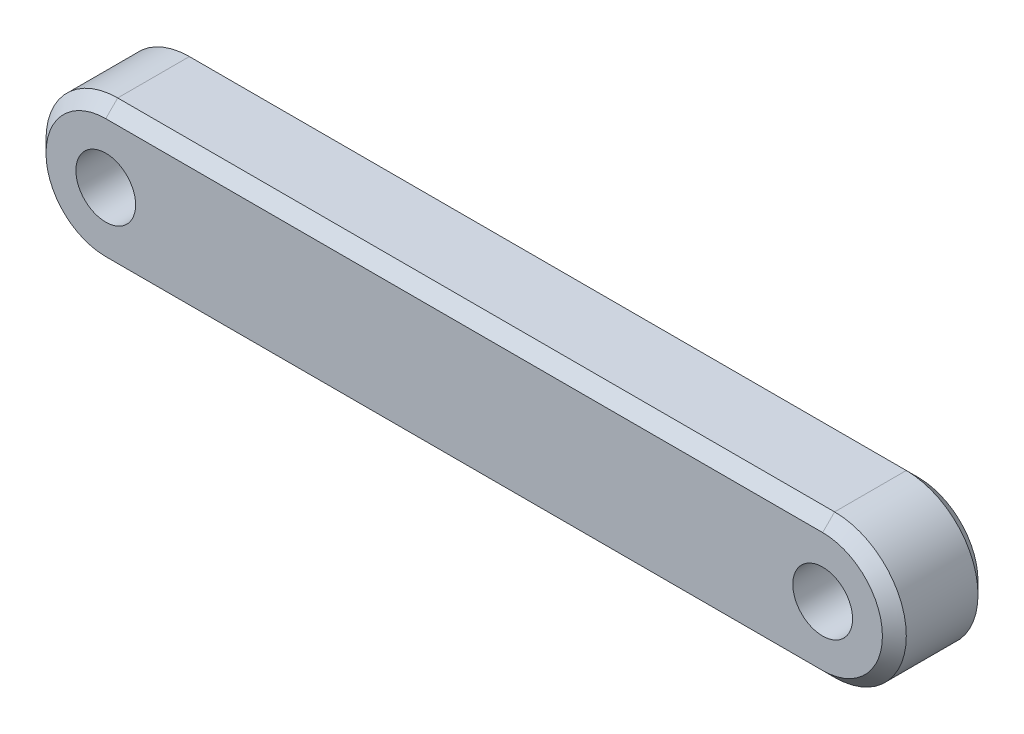
ISO-10303-21;
HEADER;
FILE_DESCRIPTION(('STEP AP214'),'2;1');
FILE_NAME('part.step','',(''),(''),'','','');
FILE_SCHEMA(('AUTOMOTIVE_DESIGN { 1 0 10303 214 1 1 1 1 }'));
ENDSEC;
DATA;
#1=APPLICATION_CONTEXT('core data for automotive mechanical design processes');
#2=APPLICATION_PROTOCOL_DEFINITION('international standard','automotive_design',2000,#1);
#3=PRODUCT_CONTEXT('',#1,'mechanical');
#4=PRODUCT('Part','Part','',(#3));
#5=PRODUCT_RELATED_PRODUCT_CATEGORY('part','',(#4));
#6=PRODUCT_DEFINITION_FORMATION('','',#4);
#7=PRODUCT_DEFINITION_CONTEXT('part definition',#1,'design');
#8=PRODUCT_DEFINITION('design','',#6,#7);
#9=PRODUCT_DEFINITION_SHAPE('','',#8);
#10=(LENGTH_UNIT() NAMED_UNIT(*) SI_UNIT(.MILLI.,.METRE.));
#11=(NAMED_UNIT(*) PLANE_ANGLE_UNIT() SI_UNIT($,.RADIAN.));
#12=(NAMED_UNIT(*) SI_UNIT($,.STERADIAN.) SOLID_ANGLE_UNIT());
#13=UNCERTAINTY_MEASURE_WITH_UNIT(LENGTH_MEASURE(1.E-05),#10,'distance_accuracy_value','');
#14=(GEOMETRIC_REPRESENTATION_CONTEXT(3) GLOBAL_UNCERTAINTY_ASSIGNED_CONTEXT((#13)) GLOBAL_UNIT_ASSIGNED_CONTEXT((#10,
#11,#12)) REPRESENTATION_CONTEXT('',''));
#15=CARTESIAN_POINT('',(0.,0.,0.));
#16=DIRECTION('',(0.,0.,1.));
#17=DIRECTION('',(1.,0.,0.));
#18=AXIS2_PLACEMENT_3D('',#15,#16,#17);
#19=CARTESIAN_POINT('',(0.,0.,4.));
#20=DIRECTION('',(0.,0.,1.));
#21=DIRECTION('',(1.,0.,0.));
#22=AXIS2_PLACEMENT_3D('',#19,#20,#21);
#23=PLANE('',#22);
#24=CARTESIAN_POINT('',(0.,0.,4.));
#25=DIRECTION('',(0.,0.,1.));
#26=DIRECTION('',(1.,0.,0.));
#27=AXIS2_PLACEMENT_3D('',#24,#25,#26);
#28=CIRCLE('',#27,2.5);
#29=CARTESIAN_POINT('',(0.,2.5,4.));
#30=VERTEX_POINT('',#29);
#31=CARTESIAN_POINT('',(0.,-2.5,4.));
#32=VERTEX_POINT('',#31);
#33=EDGE_CURVE('E66',#30,#32,#28,.T.);
#34=ORIENTED_EDGE('',*,*,#33,.T.);
#35=DIRECTION('',(1.,0.,0.));
#36=VECTOR('',#35,1.);
#37=CARTESIAN_POINT('',(30.,-2.5,4.));
#38=LINE('',#37,#36);
#39=CARTESIAN_POINT('',(30.,-2.5,4.));
#40=VERTEX_POINT('',#39);
#41=EDGE_CURVE('E11',#32,#40,#38,.T.);
#42=ORIENTED_EDGE('',*,*,#41,.T.);
#43=CARTESIAN_POINT('',(30.,0.,4.));
#44=DIRECTION('',(0.,0.,1.));
#45=DIRECTION('',(1.,0.,0.));
#46=AXIS2_PLACEMENT_3D('',#43,#44,#45);
#47=CIRCLE('',#46,2.5);
#48=CARTESIAN_POINT('',(30.,2.5,4.));
#49=VERTEX_POINT('',#48);
#50=EDGE_CURVE('E51',#40,#49,#47,.T.);
#51=ORIENTED_EDGE('',*,*,#50,.T.);
#52=DIRECTION('',(-1.,0.,0.));
#53=VECTOR('',#52,1.);
#54=CARTESIAN_POINT('',(0.,2.5,4.));
#55=LINE('',#54,#53);
#56=EDGE_CURVE('E206',#49,#30,#55,.T.);
#57=ORIENTED_EDGE('',*,*,#56,.T.);
#58=EDGE_LOOP('',(#34,#42,#51,#57));
#59=FACE_BOUND('',#58,.T.);
#60=CARTESIAN_POINT('',(30.,0.,4.));
#61=DIRECTION('',(0.,0.,1.));
#62=DIRECTION('',(1.,0.,0.));
#63=AXIS2_PLACEMENT_3D('',#60,#61,#62);
#64=CIRCLE('',#63,1.25);
#65=CARTESIAN_POINT('',(31.25,0.,4.));
#66=VERTEX_POINT('',#65);
#67=EDGE_CURVE('E178',#66,#66,#64,.T.);
#68=ORIENTED_EDGE('',*,*,#67,.F.);
#69=EDGE_LOOP('',(#68));
#70=FACE_BOUND('',#69,.T.);
#71=CARTESIAN_POINT('',(0.,0.,4.));
#72=DIRECTION('',(0.,0.,1.));
#73=DIRECTION('',(1.,0.,0.));
#74=AXIS2_PLACEMENT_3D('',#71,#72,#73);
#75=CIRCLE('',#74,1.25);
#76=CARTESIAN_POINT('',(1.25,0.,4.));
#77=VERTEX_POINT('',#76);
#78=EDGE_CURVE('E170',#77,#77,#75,.T.);
#79=ORIENTED_EDGE('',*,*,#78,.F.);
#80=EDGE_LOOP('',(#79));
#81=FACE_BOUND('',#80,.T.);
#82=ADVANCED_FACE('F41',(#59,#70,#81),#23,.T.);
#83=CARTESIAN_POINT('',(0.,0.,0.));
#84=DIRECTION('',(0.,0.,1.));
#85=DIRECTION('',(1.,0.,0.));
#86=AXIS2_PLACEMENT_3D('',#83,#84,#85);
#87=PLANE('',#86);
#88=CARTESIAN_POINT('',(30.,0.,0.));
#89=DIRECTION('',(0.,0.,1.));
#90=DIRECTION('',(1.,0.,0.));
#91=AXIS2_PLACEMENT_3D('',#88,#89,#90);
#92=CIRCLE('',#91,2.5);
#93=CARTESIAN_POINT('',(30.,2.5,0.));
#94=VERTEX_POINT('',#93);
#95=CARTESIAN_POINT('',(30.,-2.5,0.));
#96=VERTEX_POINT('',#95);
#97=EDGE_CURVE('E193',#94,#96,#92,.F.);
#98=ORIENTED_EDGE('',*,*,#97,.T.);
#99=DIRECTION('',(-1.,0.,0.));
#100=VECTOR('',#99,1.);
#101=CARTESIAN_POINT('',(0.,-2.5,0.));
#102=LINE('',#101,#100);
#103=CARTESIAN_POINT('',(0.,-2.5,0.));
#104=VERTEX_POINT('',#103);
#105=EDGE_CURVE('E122',#96,#104,#102,.T.);
#106=ORIENTED_EDGE('',*,*,#105,.T.);
#107=CARTESIAN_POINT('',(0.,0.,0.));
#108=DIRECTION('',(0.,0.,1.));
#109=DIRECTION('',(1.,0.,0.));
#110=AXIS2_PLACEMENT_3D('',#107,#108,#109);
#111=CIRCLE('',#110,2.5);
#112=CARTESIAN_POINT('',(0.,2.5,0.));
#113=VERTEX_POINT('',#112);
#114=EDGE_CURVE('E191',#104,#113,#111,.F.);
#115=ORIENTED_EDGE('',*,*,#114,.T.);
#116=DIRECTION('',(1.,0.,0.));
#117=VECTOR('',#116,1.);
#118=CARTESIAN_POINT('',(0.,2.5,0.));
#119=LINE('',#118,#117);
#120=EDGE_CURVE('E189',#113,#94,#119,.T.);
#121=ORIENTED_EDGE('',*,*,#120,.T.);
#122=EDGE_LOOP('',(#98,#106,#115,#121));
#123=FACE_BOUND('',#122,.T.);
#124=CARTESIAN_POINT('',(30.,0.,0.));
#125=DIRECTION('',(0.,0.,1.));
#126=DIRECTION('',(1.,0.,0.));
#127=AXIS2_PLACEMENT_3D('',#124,#125,#126);
#128=CIRCLE('',#127,1.25);
#129=CARTESIAN_POINT('',(31.25,0.,0.));
#130=VERTEX_POINT('',#129);
#131=EDGE_CURVE('E175',#130,#130,#128,.T.);
#132=ORIENTED_EDGE('',*,*,#131,.T.);
#133=EDGE_LOOP('',(#132));
#134=FACE_BOUND('',#133,.T.);
#135=CARTESIAN_POINT('',(0.,0.,0.));
#136=DIRECTION('',(0.,0.,1.));
#137=DIRECTION('',(1.,0.,0.));
#138=AXIS2_PLACEMENT_3D('',#135,#136,#137);
#139=CIRCLE('',#138,1.25);
#140=CARTESIAN_POINT('',(1.25,0.,0.));
#141=VERTEX_POINT('',#140);
#142=EDGE_CURVE('E164',#141,#141,#139,.T.);
#143=ORIENTED_EDGE('',*,*,#142,.T.);
#144=EDGE_LOOP('',(#143));
#145=FACE_BOUND('',#144,.T.);
#146=ADVANCED_FACE('F236',(#123,#134,#145),#87,.F.);
#147=CARTESIAN_POINT('',(0.,0.,4.));
#148=DIRECTION('',(0.,0.,-1.));
#149=DIRECTION('',(-1.,0.,0.));
#150=AXIS2_PLACEMENT_3D('',#147,#148,#149);
#151=CYLINDRICAL_SURFACE('',#150,3.);
#152=DIRECTION('',(0.,0.,-1.));
#153=VECTOR('',#152,1.);
#154=CARTESIAN_POINT('',(0.,3.,4.));
#155=LINE('',#154,#153);
#156=CARTESIAN_POINT('',(0.,3.,3.5));
#157=VERTEX_POINT('',#156);
#158=CARTESIAN_POINT('',(0.,3.,0.5));
#159=VERTEX_POINT('',#158);
#160=EDGE_CURVE('E181',#157,#159,#155,.T.);
#161=ORIENTED_EDGE('',*,*,#160,.T.);
#162=CARTESIAN_POINT('',(0.,0.,0.5));
#163=DIRECTION('',(0.,0.,1.));
#164=DIRECTION('',(1.,0.,0.));
#165=AXIS2_PLACEMENT_3D('',#162,#163,#164);
#166=CIRCLE('',#165,3.);
#167=CARTESIAN_POINT('',(0.,-3.,0.5));
#168=VERTEX_POINT('',#167);
#169=EDGE_CURVE('E200',#159,#168,#166,.T.);
#170=ORIENTED_EDGE('',*,*,#169,.T.);
#171=DIRECTION('',(0.,0.,-1.));
#172=VECTOR('',#171,1.);
#173=CARTESIAN_POINT('',(0.,-3.,4.));
#174=LINE('',#173,#172);
#175=CARTESIAN_POINT('',(0.,-3.,3.5));
#176=VERTEX_POINT('',#175);
#177=EDGE_CURVE('E133',#176,#168,#174,.T.);
#178=ORIENTED_EDGE('',*,*,#177,.F.);
#179=CARTESIAN_POINT('',(0.,0.,3.5));
#180=DIRECTION('',(0.,0.,1.));
#181=DIRECTION('',(1.,0.,0.));
#182=AXIS2_PLACEMENT_3D('',#179,#180,#181);
#183=CIRCLE('',#182,3.);
#184=EDGE_CURVE('E198',#176,#157,#183,.F.);
#185=ORIENTED_EDGE('',*,*,#184,.T.);
#186=EDGE_LOOP('',(#161,#170,#178,#185));
#187=FACE_BOUND('',#186,.T.);
#188=ADVANCED_FACE('F215',(#187),#151,.T.);
#189=CARTESIAN_POINT('',(0.,-3.,4.));
#190=DIRECTION('',(0.,1.,0.));
#191=DIRECTION('',(0.,0.,1.));
#192=AXIS2_PLACEMENT_3D('',#189,#190,#191);
#193=PLANE('',#192);
#194=ORIENTED_EDGE('',*,*,#177,.T.);
#195=DIRECTION('',(1.,0.,0.));
#196=VECTOR('',#195,1.);
#197=CARTESIAN_POINT('',(0.,-3.,0.5));
#198=LINE('',#197,#196);
#199=CARTESIAN_POINT('',(30.,-3.,0.5));
#200=VERTEX_POINT('',#199);
#201=EDGE_CURVE('E132',#168,#200,#198,.T.);
#202=ORIENTED_EDGE('',*,*,#201,.T.);
#203=DIRECTION('',(0.,0.,-1.));
#204=VECTOR('',#203,1.);
#205=CARTESIAN_POINT('',(30.,-3.,4.));
#206=LINE('',#205,#204);
#207=CARTESIAN_POINT('',(30.,-3.,3.5));
#208=VERTEX_POINT('',#207);
#209=EDGE_CURVE('E115',#208,#200,#206,.T.);
#210=ORIENTED_EDGE('',*,*,#209,.F.);
#211=DIRECTION('',(-1.,0.,0.));
#212=VECTOR('',#211,1.);
#213=CARTESIAN_POINT('',(0.,-3.,3.5));
#214=LINE('',#213,#212);
#215=EDGE_CURVE('E129',#208,#176,#214,.T.);
#216=ORIENTED_EDGE('',*,*,#215,.T.);
#217=EDGE_LOOP('',(#194,#202,#210,#216));
#218=FACE_BOUND('',#217,.T.);
#219=ADVANCED_FACE('F128',(#218),#193,.F.);
#220=CARTESIAN_POINT('',(30.,0.,4.));
#221=DIRECTION('',(0.,0.,-1.));
#222=DIRECTION('',(-1.,0.,0.));
#223=AXIS2_PLACEMENT_3D('',#220,#221,#222);
#224=CYLINDRICAL_SURFACE('',#223,3.);
#225=ORIENTED_EDGE('',*,*,#209,.T.);
#226=CARTESIAN_POINT('',(30.,0.,0.5));
#227=DIRECTION('',(0.,0.,1.));
#228=DIRECTION('',(1.,0.,0.));
#229=AXIS2_PLACEMENT_3D('',#226,#227,#228);
#230=CIRCLE('',#229,3.);
#231=CARTESIAN_POINT('',(30.,3.,0.5));
#232=VERTEX_POINT('',#231);
#233=EDGE_CURVE('E121',#200,#232,#230,.T.);
#234=ORIENTED_EDGE('',*,*,#233,.T.);
#235=DIRECTION('',(0.,0.,-1.));
#236=VECTOR('',#235,1.);
#237=CARTESIAN_POINT('',(30.,3.,4.));
#238=LINE('',#237,#236);
#239=CARTESIAN_POINT('',(30.,3.,3.5));
#240=VERTEX_POINT('',#239);
#241=EDGE_CURVE('E117',#240,#232,#238,.T.);
#242=ORIENTED_EDGE('',*,*,#241,.F.);
#243=CARTESIAN_POINT('',(30.,0.,3.5));
#244=DIRECTION('',(0.,0.,1.));
#245=DIRECTION('',(1.,0.,0.));
#246=AXIS2_PLACEMENT_3D('',#243,#244,#245);
#247=CIRCLE('',#246,3.);
#248=EDGE_CURVE('E112',#240,#208,#247,.F.);
#249=ORIENTED_EDGE('',*,*,#248,.T.);
#250=EDGE_LOOP('',(#225,#234,#242,#249));
#251=FACE_BOUND('',#250,.T.);
#252=ADVANCED_FACE('F114',(#251),#224,.T.);
#253=CARTESIAN_POINT('',(0.,3.,4.));
#254=DIRECTION('',(0.,-1.,0.));
#255=DIRECTION('',(0.,0.,-1.));
#256=AXIS2_PLACEMENT_3D('',#253,#254,#255);
#257=PLANE('',#256);
#258=ORIENTED_EDGE('',*,*,#241,.T.);
#259=DIRECTION('',(-1.,0.,0.));
#260=VECTOR('',#259,1.);
#261=CARTESIAN_POINT('',(0.,3.,0.5));
#262=LINE('',#261,#260);
#263=EDGE_CURVE('E204',#232,#159,#262,.T.);
#264=ORIENTED_EDGE('',*,*,#263,.T.);
#265=ORIENTED_EDGE('',*,*,#160,.F.);
#266=DIRECTION('',(1.,0.,0.));
#267=VECTOR('',#266,1.);
#268=CARTESIAN_POINT('',(30.,3.,3.5));
#269=LINE('',#268,#267);
#270=EDGE_CURVE('E202',#157,#240,#269,.T.);
#271=ORIENTED_EDGE('',*,*,#270,.T.);
#272=EDGE_LOOP('',(#258,#264,#265,#271));
#273=FACE_BOUND('',#272,.T.);
#274=ADVANCED_FACE('F217',(#273),#257,.F.);
#275=CARTESIAN_POINT('',(30.,0.,4.));
#276=DIRECTION('',(0.,0.,-1.));
#277=DIRECTION('',(-1.,0.,0.));
#278=AXIS2_PLACEMENT_3D('',#275,#276,#277);
#279=CYLINDRICAL_SURFACE('',#278,1.25);
#280=ORIENTED_EDGE('',*,*,#67,.T.);
#281=EDGE_LOOP('',(#280));
#282=FACE_BOUND('',#281,.T.);
#283=ORIENTED_EDGE('',*,*,#131,.F.);
#284=EDGE_LOOP('',(#283));
#285=FACE_BOUND('',#284,.T.);
#286=ADVANCED_FACE('F244',(#282,#285),#279,.F.);
#287=CARTESIAN_POINT('',(0.,0.,4.));
#288=DIRECTION('',(0.,0.,-1.));
#289=DIRECTION('',(-1.,0.,0.));
#290=AXIS2_PLACEMENT_3D('',#287,#288,#289);
#291=CYLINDRICAL_SURFACE('',#290,1.25);
#292=ORIENTED_EDGE('',*,*,#78,.T.);
#293=EDGE_LOOP('',(#292));
#294=FACE_BOUND('',#293,.T.);
#295=ORIENTED_EDGE('',*,*,#142,.F.);
#296=EDGE_LOOP('',(#295));
#297=FACE_BOUND('',#296,.T.);
#298=ADVANCED_FACE('F275',(#294,#297),#291,.F.);
#299=CARTESIAN_POINT('',(0.,3.,0.5));
#300=DIRECTION('',(0.,-0.707106781186545,0.70710678118655));
#301=DIRECTION('',(-1.,0.,0.));
#302=AXIS2_PLACEMENT_3D('',#299,#300,#301);
#303=PLANE('',#302);
#304=DIRECTION('',(0.,0.70710678118655,0.707106781186545));
#305=VECTOR('',#304,1.);
#306=CARTESIAN_POINT('',(30.,2.5,0.));
#307=LINE('',#306,#305);
#308=EDGE_CURVE('E156',#94,#232,#307,.T.);
#309=ORIENTED_EDGE('',*,*,#308,.F.);
#310=ORIENTED_EDGE('',*,*,#120,.F.);
#311=DIRECTION('',(0.,-0.70710678118655,-0.707106781186545));
#312=VECTOR('',#311,1.);
#313=CARTESIAN_POINT('',(0.,3.,0.5));
#314=LINE('',#313,#312);
#315=EDGE_CURVE('E144',#159,#113,#314,.T.);
#316=ORIENTED_EDGE('',*,*,#315,.F.);
#317=ORIENTED_EDGE('',*,*,#263,.F.);
#318=EDGE_LOOP('',(#309,#310,#316,#317));
#319=FACE_BOUND('',#318,.T.);
#320=ADVANCED_FACE('F220',(#319),#303,.F.);
#321=CARTESIAN_POINT('',(0.,0.,0.5));
#322=DIRECTION('',(0.,0.,1.));
#323=DIRECTION('',(1.,0.,0.));
#324=AXIS2_PLACEMENT_3D('',#321,#322,#323);
#325=CONICAL_SURFACE('',#324,3.,0.785398163397452);
#326=ORIENTED_EDGE('',*,*,#315,.T.);
#327=ORIENTED_EDGE('',*,*,#114,.F.);
#328=DIRECTION('',(0.,0.70710678118655,-0.707106781186545));
#329=VECTOR('',#328,1.);
#330=CARTESIAN_POINT('',(0.,-3.,0.5));
#331=LINE('',#330,#329);
#332=EDGE_CURVE('E150',#168,#104,#331,.T.);
#333=ORIENTED_EDGE('',*,*,#332,.F.);
#334=ORIENTED_EDGE('',*,*,#169,.F.);
#335=EDGE_LOOP('',(#326,#327,#333,#334));
#336=FACE_BOUND('',#335,.T.);
#337=ADVANCED_FACE('F223',(#336),#325,.T.);
#338=CARTESIAN_POINT('',(30.,0.,0.5));
#339=DIRECTION('',(0.,0.,1.));
#340=DIRECTION('',(1.,0.,0.));
#341=AXIS2_PLACEMENT_3D('',#338,#339,#340);
#342=CONICAL_SURFACE('',#341,3.,0.785398163397452);
#343=ORIENTED_EDGE('',*,*,#308,.T.);
#344=ORIENTED_EDGE('',*,*,#233,.F.);
#345=DIRECTION('',(0.,-0.70710678118655,0.707106781186545));
#346=VECTOR('',#345,1.);
#347=CARTESIAN_POINT('',(30.,-2.5,0.));
#348=LINE('',#347,#346);
#349=EDGE_CURVE('E147',#96,#200,#348,.T.);
#350=ORIENTED_EDGE('',*,*,#349,.F.);
#351=ORIENTED_EDGE('',*,*,#97,.F.);
#352=EDGE_LOOP('',(#343,#344,#350,#351));
#353=FACE_BOUND('',#352,.T.);
#354=ADVANCED_FACE('F226',(#353),#342,.T.);
#355=CARTESIAN_POINT('',(0.,-3.,0.5));
#356=DIRECTION('',(0.,0.707106781186545,0.70710678118655));
#357=DIRECTION('',(1.,0.,0.));
#358=AXIS2_PLACEMENT_3D('',#355,#356,#357);
#359=PLANE('',#358);
#360=ORIENTED_EDGE('',*,*,#332,.T.);
#361=ORIENTED_EDGE('',*,*,#105,.F.);
#362=ORIENTED_EDGE('',*,*,#349,.T.);
#363=ORIENTED_EDGE('',*,*,#201,.F.);
#364=EDGE_LOOP('',(#360,#361,#362,#363));
#365=FACE_BOUND('',#364,.T.);
#366=ADVANCED_FACE('F224',(#365),#359,.F.);
#367=CARTESIAN_POINT('',(0.,2.5,4.));
#368=DIRECTION('',(0.,0.70710678118655,0.707106781186545));
#369=DIRECTION('',(1.,0.,0.));
#370=AXIS2_PLACEMENT_3D('',#367,#368,#369);
#371=PLANE('',#370);
#372=DIRECTION('',(0.,-0.707106781186545,0.70710678118655));
#373=VECTOR('',#372,1.);
#374=CARTESIAN_POINT('',(30.,3.,3.5));
#375=LINE('',#374,#373);
#376=EDGE_CURVE('E141',#240,#49,#375,.T.);
#377=ORIENTED_EDGE('',*,*,#376,.F.);
#378=ORIENTED_EDGE('',*,*,#270,.F.);
#379=DIRECTION('',(0.,0.707106781186545,-0.70710678118655));
#380=VECTOR('',#379,1.);
#381=CARTESIAN_POINT('',(0.,2.5,4.));
#382=LINE('',#381,#380);
#383=EDGE_CURVE('E46',#30,#157,#382,.T.);
#384=ORIENTED_EDGE('',*,*,#383,.F.);
#385=ORIENTED_EDGE('',*,*,#56,.F.);
#386=EDGE_LOOP('',(#377,#378,#384,#385));
#387=FACE_BOUND('',#386,.T.);
#388=ADVANCED_FACE('F44',(#387),#371,.T.);
#389=CARTESIAN_POINT('',(0.,0.,4.));
#390=DIRECTION('',(0.,0.,-1.));
#391=DIRECTION('',(-1.,0.,0.));
#392=AXIS2_PLACEMENT_3D('',#389,#390,#391);
#393=CONICAL_SURFACE('',#392,2.5,0.785398163397445);
#394=ORIENTED_EDGE('',*,*,#383,.T.);
#395=ORIENTED_EDGE('',*,*,#184,.F.);
#396=DIRECTION('',(0.,-0.707106781186545,-0.70710678118655));
#397=VECTOR('',#396,1.);
#398=CARTESIAN_POINT('',(0.,-2.5,4.));
#399=LINE('',#398,#397);
#400=EDGE_CURVE('E136',#32,#176,#399,.T.);
#401=ORIENTED_EDGE('',*,*,#400,.F.);
#402=ORIENTED_EDGE('',*,*,#33,.F.);
#403=EDGE_LOOP('',(#394,#395,#401,#402));
#404=FACE_BOUND('',#403,.T.);
#405=ADVANCED_FACE('F212',(#404),#393,.T.);
#406=CARTESIAN_POINT('',(30.,0.,4.));
#407=DIRECTION('',(0.,0.,-1.));
#408=DIRECTION('',(-1.,0.,0.));
#409=AXIS2_PLACEMENT_3D('',#406,#407,#408);
#410=CONICAL_SURFACE('',#409,2.5,0.785398163397445);
#411=ORIENTED_EDGE('',*,*,#376,.T.);
#412=ORIENTED_EDGE('',*,*,#50,.F.);
#413=DIRECTION('',(0.,0.707106781186545,0.70710678118655));
#414=VECTOR('',#413,1.);
#415=CARTESIAN_POINT('',(30.,-3.,3.5));
#416=LINE('',#415,#414);
#417=EDGE_CURVE('E59',#208,#40,#416,.T.);
#418=ORIENTED_EDGE('',*,*,#417,.F.);
#419=ORIENTED_EDGE('',*,*,#248,.F.);
#420=EDGE_LOOP('',(#411,#412,#418,#419));
#421=FACE_BOUND('',#420,.T.);
#422=ADVANCED_FACE('F139',(#421),#410,.T.);
#423=CARTESIAN_POINT('',(0.,-2.5,4.));
#424=DIRECTION('',(0.,-0.70710678118655,0.707106781186545));
#425=DIRECTION('',(-1.,0.,0.));
#426=AXIS2_PLACEMENT_3D('',#423,#424,#425);
#427=PLANE('',#426);
#428=ORIENTED_EDGE('',*,*,#400,.T.);
#429=ORIENTED_EDGE('',*,*,#215,.F.);
#430=ORIENTED_EDGE('',*,*,#417,.T.);
#431=ORIENTED_EDGE('',*,*,#41,.F.);
#432=EDGE_LOOP('',(#428,#429,#430,#431));
#433=FACE_BOUND('',#432,.T.);
#434=ADVANCED_FACE('F135',(#433),#427,.T.);
#435=CLOSED_SHELL('',(#82,#146,#188,#219,#252,#274,#286,#298,#320,#337,#354,#366,#388,#405,#422,#434));
#436=MANIFOLD_SOLID_BREP('B2',#435);
#437=ADVANCED_BREP_SHAPE_REPRESENTATION('',(#18,#436),#14);
#438=SHAPE_DEFINITION_REPRESENTATION(#9,#437);
ENDSEC;
END-ISO-10303-21;
